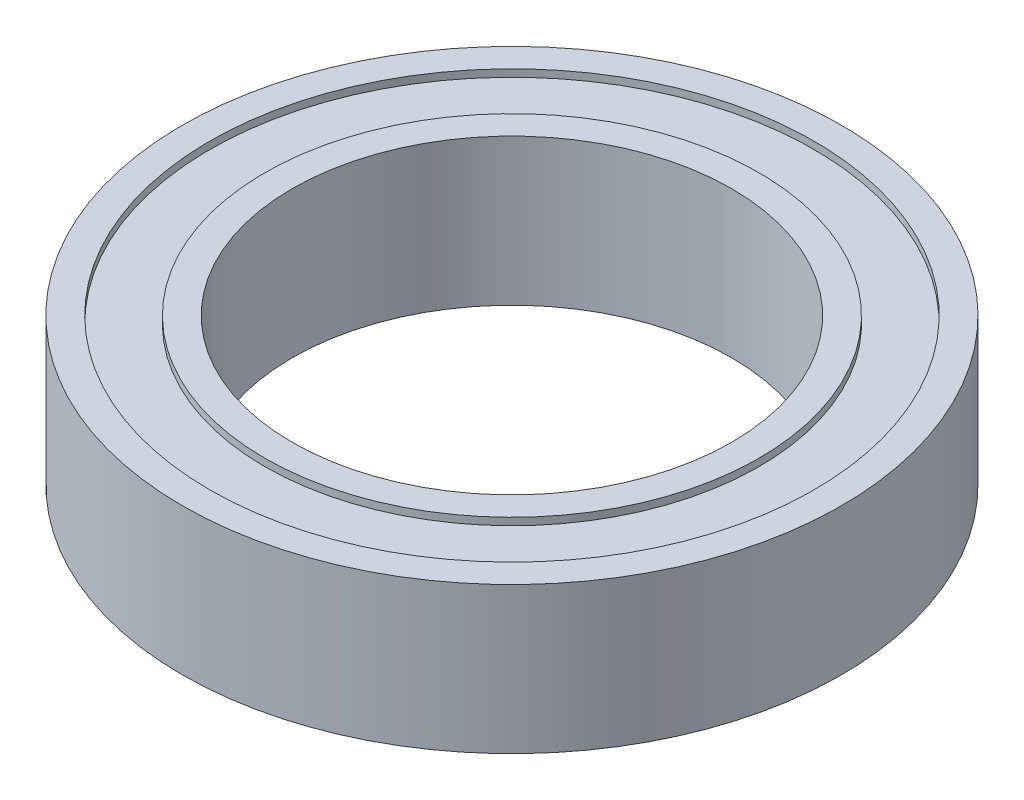
ISO-10303-21;
HEADER;
FILE_DESCRIPTION(('STEP AP214'),'2;1');
FILE_NAME('part.step','',(''),(''),'','','');
FILE_SCHEMA(('AUTOMOTIVE_DESIGN { 1 0 10303 214 1 1 1 1 }'));
ENDSEC;
DATA;
#1=APPLICATION_CONTEXT('core data for automotive mechanical design processes');
#2=APPLICATION_PROTOCOL_DEFINITION('international standard','automotive_design',2000,#1);
#3=PRODUCT_CONTEXT('',#1,'mechanical');
#4=PRODUCT('Part','Part','',(#3));
#5=PRODUCT_RELATED_PRODUCT_CATEGORY('part','',(#4));
#6=PRODUCT_DEFINITION_FORMATION('','',#4);
#7=PRODUCT_DEFINITION_CONTEXT('part definition',#1,'design');
#8=PRODUCT_DEFINITION('design','',#6,#7);
#9=PRODUCT_DEFINITION_SHAPE('','',#8);
#10=(LENGTH_UNIT() NAMED_UNIT(*) SI_UNIT(.MILLI.,.METRE.));
#11=(NAMED_UNIT(*) PLANE_ANGLE_UNIT() SI_UNIT($,.RADIAN.));
#12=(NAMED_UNIT(*) SI_UNIT($,.STERADIAN.) SOLID_ANGLE_UNIT());
#13=UNCERTAINTY_MEASURE_WITH_UNIT(LENGTH_MEASURE(1.E-05),#10,'distance_accuracy_value','');
#14=(GEOMETRIC_REPRESENTATION_CONTEXT(3) GLOBAL_UNCERTAINTY_ASSIGNED_CONTEXT((#13)) GLOBAL_UNIT_ASSIGNED_CONTEXT((#10,
#11,#12)) REPRESENTATION_CONTEXT('',''));
#15=CARTESIAN_POINT('',(0.,0.,0.));
#16=DIRECTION('',(0.,0.,1.));
#17=DIRECTION('',(1.,0.,0.));
#18=AXIS2_PLACEMENT_3D('',#15,#16,#17);
#19=CARTESIAN_POINT('',(0.,-2.,0.));
#20=DIRECTION('',(0.,1.,0.));
#21=DIRECTION('',(0.,0.,1.));
#22=AXIS2_PLACEMENT_3D('',#19,#20,#21);
#23=PLANE('',#22);
#24=CARTESIAN_POINT('',(0.,-2.,0.));
#25=DIRECTION('',(0.,1.,0.));
#26=DIRECTION('',(0.,0.,1.));
#27=AXIS2_PLACEMENT_3D('',#24,#25,#26);
#28=CIRCLE('',#27,6.);
#29=CARTESIAN_POINT('',(0.,-2.,6.));
#30=VERTEX_POINT('',#29);
#31=EDGE_CURVE('E40',#30,#30,#28,.T.);
#32=ORIENTED_EDGE('',*,*,#31,.T.);
#33=EDGE_LOOP('',(#32));
#34=FACE_BOUND('',#33,.T.);
#35=CARTESIAN_POINT('',(0.,-2.,0.));
#36=DIRECTION('',(0.,1.,0.));
#37=DIRECTION('',(0.,0.,1.));
#38=AXIS2_PLACEMENT_3D('',#35,#36,#37);
#39=CIRCLE('',#38,6.75);
#40=CARTESIAN_POINT('',(0.,-2.,6.75));
#41=VERTEX_POINT('',#40);
#42=EDGE_CURVE('E72',#41,#41,#39,.T.);
#43=ORIENTED_EDGE('',*,*,#42,.F.);
#44=EDGE_LOOP('',(#43));
#45=FACE_BOUND('',#44,.T.);
#46=ADVANCED_FACE('F33',(#34,#45),#23,.F.);
#47=CARTESIAN_POINT('',(0.,2.,0.));
#48=DIRECTION('',(0.,1.,0.));
#49=DIRECTION('',(0.,0.,1.));
#50=AXIS2_PLACEMENT_3D('',#47,#48,#49);
#51=PLANE('',#50);
#52=CARTESIAN_POINT('',(0.,2.,0.));
#53=DIRECTION('',(0.,1.,0.));
#54=DIRECTION('',(0.,0.,1.));
#55=AXIS2_PLACEMENT_3D('',#52,#53,#54);
#56=CIRCLE('',#55,6.);
#57=CARTESIAN_POINT('',(0.,2.,6.));
#58=VERTEX_POINT('',#57);
#59=EDGE_CURVE('E48',#58,#58,#56,.T.);
#60=ORIENTED_EDGE('',*,*,#59,.F.);
#61=EDGE_LOOP('',(#60));
#62=FACE_BOUND('',#61,.T.);
#63=CARTESIAN_POINT('',(0.,2.,0.));
#64=DIRECTION('',(0.,1.,0.));
#65=DIRECTION('',(0.,0.,1.));
#66=AXIS2_PLACEMENT_3D('',#63,#64,#65);
#67=CIRCLE('',#66,6.75);
#68=CARTESIAN_POINT('',(0.,2.,6.75));
#69=VERTEX_POINT('',#68);
#70=EDGE_CURVE('E60',#69,#69,#67,.T.);
#71=ORIENTED_EDGE('',*,*,#70,.T.);
#72=EDGE_LOOP('',(#71));
#73=FACE_BOUND('',#72,.T.);
#74=ADVANCED_FACE('F88',(#62,#73),#51,.T.);
#75=CARTESIAN_POINT('',(0.,-2.,0.));
#76=DIRECTION('',(0.,1.,0.));
#77=DIRECTION('',(0.,0.,1.));
#78=AXIS2_PLACEMENT_3D('',#75,#76,#77);
#79=CYLINDRICAL_SURFACE('',#78,9.);
#80=CARTESIAN_POINT('',(0.,-2.,0.));
#81=DIRECTION('',(0.,1.,0.));
#82=DIRECTION('',(0.,0.,1.));
#83=AXIS2_PLACEMENT_3D('',#80,#81,#82);
#84=CIRCLE('',#83,9.);
#85=CARTESIAN_POINT('',(0.,-2.,9.));
#86=VERTEX_POINT('',#85);
#87=EDGE_CURVE('E10',#86,#86,#84,.T.);
#88=ORIENTED_EDGE('',*,*,#87,.T.);
#89=EDGE_LOOP('',(#88));
#90=FACE_BOUND('',#89,.T.);
#91=CARTESIAN_POINT('',(0.,2.,0.));
#92=DIRECTION('',(0.,1.,0.));
#93=DIRECTION('',(0.,0.,1.));
#94=AXIS2_PLACEMENT_3D('',#91,#92,#93);
#95=CIRCLE('',#94,9.);
#96=CARTESIAN_POINT('',(0.,2.,9.));
#97=VERTEX_POINT('',#96);
#98=EDGE_CURVE('E44',#97,#97,#95,.T.);
#99=ORIENTED_EDGE('',*,*,#98,.F.);
#100=EDGE_LOOP('',(#99));
#101=FACE_BOUND('',#100,.T.);
#102=ADVANCED_FACE('F35',(#90,#101),#79,.T.);
#103=CARTESIAN_POINT('',(0.,-2.,0.));
#104=DIRECTION('',(0.,1.,0.));
#105=DIRECTION('',(0.,0.,1.));
#106=AXIS2_PLACEMENT_3D('',#103,#104,#105);
#107=CIRCLE('',#106,8.25);
#108=CARTESIAN_POINT('',(0.,-2.,8.25));
#109=VERTEX_POINT('',#108);
#110=EDGE_CURVE('E66',#109,#109,#107,.T.);
#111=ORIENTED_EDGE('',*,*,#110,.T.);
#112=EDGE_LOOP('',(#111));
#113=FACE_BOUND('',#112,.T.);
#114=ORIENTED_EDGE('',*,*,#87,.F.);
#115=EDGE_LOOP('',(#114));
#116=FACE_BOUND('',#115,.T.);
#117=ADVANCED_FACE('F89',(#113,#116),#23,.F.);
#118=CARTESIAN_POINT('',(0.,-2.,0.));
#119=DIRECTION('',(0.,1.,0.));
#120=DIRECTION('',(0.,0.,1.));
#121=AXIS2_PLACEMENT_3D('',#118,#119,#120);
#122=CYLINDRICAL_SURFACE('',#121,6.);
#123=ORIENTED_EDGE('',*,*,#31,.F.);
#124=EDGE_LOOP('',(#123));
#125=FACE_BOUND('',#124,.T.);
#126=ORIENTED_EDGE('',*,*,#59,.T.);
#127=EDGE_LOOP('',(#126));
#128=FACE_BOUND('',#127,.T.);
#129=ADVANCED_FACE('F98',(#125,#128),#122,.F.);
#130=CARTESIAN_POINT('',(0.,2.,0.));
#131=DIRECTION('',(0.,1.,0.));
#132=DIRECTION('',(0.,0.,1.));
#133=AXIS2_PLACEMENT_3D('',#130,#131,#132);
#134=CIRCLE('',#133,8.25);
#135=CARTESIAN_POINT('',(0.,2.,8.25));
#136=VERTEX_POINT('',#135);
#137=EDGE_CURVE('E54',#136,#136,#134,.T.);
#138=ORIENTED_EDGE('',*,*,#137,.F.);
#139=EDGE_LOOP('',(#138));
#140=FACE_BOUND('',#139,.T.);
#141=ORIENTED_EDGE('',*,*,#98,.T.);
#142=EDGE_LOOP('',(#141));
#143=FACE_BOUND('',#142,.T.);
#144=ADVANCED_FACE('F95',(#140,#143),#51,.T.);
#145=CARTESIAN_POINT('',(0.,1.8,0.));
#146=DIRECTION('',(0.,1.,0.));
#147=DIRECTION('',(0.,0.,1.));
#148=AXIS2_PLACEMENT_3D('',#145,#146,#147);
#149=CYLINDRICAL_SURFACE('',#148,8.25);
#150=CARTESIAN_POINT('',(0.,1.8,0.));
#151=DIRECTION('',(0.,1.,0.));
#152=DIRECTION('',(0.,0.,1.));
#153=AXIS2_PLACEMENT_3D('',#150,#151,#152);
#154=CIRCLE('',#153,8.25);
#155=CARTESIAN_POINT('',(0.,1.8,8.25));
#156=VERTEX_POINT('',#155);
#157=EDGE_CURVE('E53',#156,#156,#154,.T.);
#158=ORIENTED_EDGE('',*,*,#157,.F.);
#159=EDGE_LOOP('',(#158));
#160=FACE_BOUND('',#159,.T.);
#161=ORIENTED_EDGE('',*,*,#137,.T.);
#162=EDGE_LOOP('',(#161));
#163=FACE_BOUND('',#162,.T.);
#164=ADVANCED_FACE('F124',(#160,#163),#149,.F.);
#165=CARTESIAN_POINT('',(0.,1.8,0.));
#166=DIRECTION('',(0.,1.,0.));
#167=DIRECTION('',(0.,0.,1.));
#168=AXIS2_PLACEMENT_3D('',#165,#166,#167);
#169=PLANE('',#168);
#170=CARTESIAN_POINT('',(0.,1.8,0.));
#171=DIRECTION('',(0.,1.,0.));
#172=DIRECTION('',(0.,0.,1.));
#173=AXIS2_PLACEMENT_3D('',#170,#171,#172);
#174=CIRCLE('',#173,6.75);
#175=CARTESIAN_POINT('',(0.,1.8,6.75));
#176=VERTEX_POINT('',#175);
#177=EDGE_CURVE('E57',#176,#176,#174,.T.);
#178=ORIENTED_EDGE('',*,*,#177,.F.);
#179=EDGE_LOOP('',(#178));
#180=FACE_BOUND('',#179,.T.);
#181=ORIENTED_EDGE('',*,*,#157,.T.);
#182=EDGE_LOOP('',(#181));
#183=FACE_BOUND('',#182,.T.);
#184=ADVANCED_FACE('F120',(#180,#183),#169,.T.);
#185=CARTESIAN_POINT('',(0.,1.8,0.));
#186=DIRECTION('',(0.,1.,0.));
#187=DIRECTION('',(0.,0.,1.));
#188=AXIS2_PLACEMENT_3D('',#185,#186,#187);
#189=CYLINDRICAL_SURFACE('',#188,6.75);
#190=ORIENTED_EDGE('',*,*,#177,.T.);
#191=EDGE_LOOP('',(#190));
#192=FACE_BOUND('',#191,.T.);
#193=ORIENTED_EDGE('',*,*,#70,.F.);
#194=EDGE_LOOP('',(#193));
#195=FACE_BOUND('',#194,.T.);
#196=ADVANCED_FACE('F114',(#192,#195),#189,.T.);
#197=CARTESIAN_POINT('',(0.,-1.8,0.));
#198=DIRECTION('',(0.,-1.,0.));
#199=DIRECTION('',(0.,0.,1.));
#200=AXIS2_PLACEMENT_3D('',#197,#198,#199);
#201=PLANE('',#200);
#202=CARTESIAN_POINT('',(0.,-1.8,0.));
#203=DIRECTION('',(0.,1.,0.));
#204=DIRECTION('',(0.,0.,1.));
#205=AXIS2_PLACEMENT_3D('',#202,#203,#204);
#206=CIRCLE('',#205,8.25);
#207=CARTESIAN_POINT('',(0.,-1.8,8.25));
#208=VERTEX_POINT('',#207);
#209=EDGE_CURVE('E63',#208,#208,#206,.T.);
#210=ORIENTED_EDGE('',*,*,#209,.F.);
#211=EDGE_LOOP('',(#210));
#212=FACE_BOUND('',#211,.T.);
#213=CARTESIAN_POINT('',(0.,-1.8,0.));
#214=DIRECTION('',(0.,1.,0.));
#215=DIRECTION('',(0.,0.,1.));
#216=AXIS2_PLACEMENT_3D('',#213,#214,#215);
#217=CIRCLE('',#216,6.75);
#218=CARTESIAN_POINT('',(0.,-1.8,6.75));
#219=VERTEX_POINT('',#218);
#220=EDGE_CURVE('E69',#219,#219,#217,.T.);
#221=ORIENTED_EDGE('',*,*,#220,.T.);
#222=EDGE_LOOP('',(#221));
#223=FACE_BOUND('',#222,.T.);
#224=ADVANCED_FACE('F78',(#212,#223),#201,.T.);
#225=CARTESIAN_POINT('',(0.,-1.8,0.));
#226=DIRECTION('',(0.,-1.,0.));
#227=DIRECTION('',(0.,0.,-1.));
#228=AXIS2_PLACEMENT_3D('',#225,#226,#227);
#229=CYLINDRICAL_SURFACE('',#228,8.25);
#230=ORIENTED_EDGE('',*,*,#209,.T.);
#231=EDGE_LOOP('',(#230));
#232=FACE_BOUND('',#231,.T.);
#233=ORIENTED_EDGE('',*,*,#110,.F.);
#234=EDGE_LOOP('',(#233));
#235=FACE_BOUND('',#234,.T.);
#236=ADVANCED_FACE('F83',(#232,#235),#229,.F.);
#237=CARTESIAN_POINT('',(0.,-1.8,0.));
#238=DIRECTION('',(0.,-1.,0.));
#239=DIRECTION('',(0.,0.,-1.));
#240=AXIS2_PLACEMENT_3D('',#237,#238,#239);
#241=CYLINDRICAL_SURFACE('',#240,6.75);
#242=ORIENTED_EDGE('',*,*,#220,.F.);
#243=EDGE_LOOP('',(#242));
#244=FACE_BOUND('',#243,.T.);
#245=ORIENTED_EDGE('',*,*,#42,.T.);
#246=EDGE_LOOP('',(#245));
#247=FACE_BOUND('',#246,.T.);
#248=ADVANCED_FACE('F80',(#244,#247),#241,.T.);
#249=CLOSED_SHELL('',(#46,#74,#102,#117,#129,#144,#164,#184,#196,#224,#236,#248));
#250=MANIFOLD_SOLID_BREP('B2',#249);
#251=ADVANCED_BREP_SHAPE_REPRESENTATION('',(#18,#250),#14);
#252=SHAPE_DEFINITION_REPRESENTATION(#9,#251);
ENDSEC;
END-ISO-10303-21;
